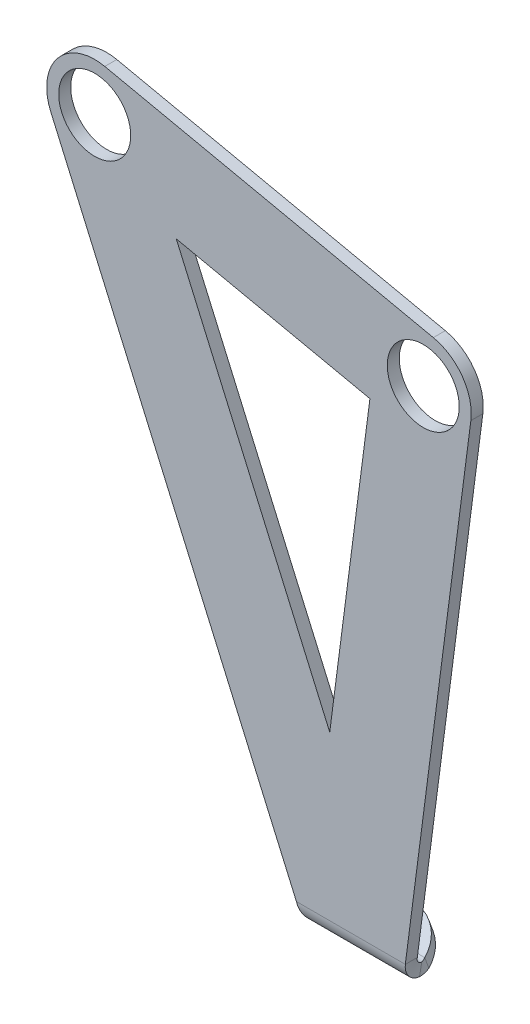
ISO-10303-21;
HEADER;
FILE_DESCRIPTION(('STEP AP214'),'2;1');
FILE_NAME('part.step','',(''),(''),'','','');
FILE_SCHEMA(('AUTOMOTIVE_DESIGN { 1 0 10303 214 1 1 1 1 }'));
ENDSEC;
DATA;
#1=APPLICATION_CONTEXT('core data for automotive mechanical design processes');
#2=APPLICATION_PROTOCOL_DEFINITION('international standard','automotive_design',2000,#1);
#3=PRODUCT_CONTEXT('',#1,'mechanical');
#4=PRODUCT('Part','Part','',(#3));
#5=PRODUCT_RELATED_PRODUCT_CATEGORY('part','',(#4));
#6=PRODUCT_DEFINITION_FORMATION('','',#4);
#7=PRODUCT_DEFINITION_CONTEXT('part definition',#1,'design');
#8=PRODUCT_DEFINITION('design','',#6,#7);
#9=PRODUCT_DEFINITION_SHAPE('','',#8);
#10=(LENGTH_UNIT() NAMED_UNIT(*) SI_UNIT(.MILLI.,.METRE.));
#11=(NAMED_UNIT(*) PLANE_ANGLE_UNIT() SI_UNIT($,.RADIAN.));
#12=(NAMED_UNIT(*) SI_UNIT($,.STERADIAN.) SOLID_ANGLE_UNIT());
#13=UNCERTAINTY_MEASURE_WITH_UNIT(LENGTH_MEASURE(1.E-05),#10,'distance_accuracy_value','');
#14=(GEOMETRIC_REPRESENTATION_CONTEXT(3) GLOBAL_UNCERTAINTY_ASSIGNED_CONTEXT((#13)) GLOBAL_UNIT_ASSIGNED_CONTEXT((#10,
#11,#12)) REPRESENTATION_CONTEXT('',''));
#15=CARTESIAN_POINT('',(0.,0.,0.));
#16=DIRECTION('',(0.,0.,1.));
#17=DIRECTION('',(1.,0.,0.));
#18=AXIS2_PLACEMENT_3D('',#15,#16,#17);
#19=CARTESIAN_POINT('',(-43.1578263867237,-76.3175069818538,1.));
#20=DIRECTION('',(-0.991640383095141,0.12903236266504,0.));
#21=DIRECTION('',(-0.12903236266504,-0.991640383095141,0.));
#22=AXIS2_PLACEMENT_3D('',#19,#20,#21);
#23=PLANE('',#22);
#24=DIRECTION('',(0.12903236266504,0.991640383095141,0.));
#25=VECTOR('',#24,1.);
#26=CARTESIAN_POINT('',(-43.1578263867237,-76.3175069818538,1.));
#27=LINE('',#26,#25);
#28=CARTESIAN_POINT('',(-42.936208375306,-74.6143267470348,1.));
#29=VERTEX_POINT('',#28);
#30=CARTESIAN_POINT('',(-37.475147726472,-32.644946646838,1.));
#31=VERTEX_POINT('',#30);
#32=EDGE_CURVE('E358',#29,#31,#27,.T.);
#33=ORIENTED_EDGE('',*,*,#32,.F.);
#34=CARTESIAN_POINT('',(-42.936208375306,-74.6143267470348,0.));
#35=CARTESIAN_POINT('',(-42.936208375306,-74.6143267470348,1.));
#36=B_SPLINE_CURVE_WITH_KNOTS('',1,(#34,#35),.UNSPECIFIED.,.F.,.F.,(2,2),(0.,1.),.UNSPECIFIED.);
#37=CARTESIAN_POINT('',(-42.936208375306,-74.6143267470348,0.));
#38=VERTEX_POINT('',#37);
#39=EDGE_CURVE('E12',#29,#38,#36,.F.);
#40=ORIENTED_EDGE('',*,*,#39,.T.);
#41=DIRECTION('',(0.12903236266504,0.991640383095141,0.));
#42=VECTOR('',#41,1.);
#43=CARTESIAN_POINT('',(-43.1578263867237,-76.3175069818538,0.));
#44=LINE('',#43,#42);
#45=CARTESIAN_POINT('',(-37.475147726472,-32.644946646838,0.));
#46=VERTEX_POINT('',#45);
#47=EDGE_CURVE('E366',#38,#46,#44,.T.);
#48=ORIENTED_EDGE('',*,*,#47,.T.);
#49=DIRECTION('',(0.,0.,-1.));
#50=VECTOR('',#49,1.);
#51=CARTESIAN_POINT('',(-37.475147726472,-32.644946646838,1.));
#52=LINE('',#51,#50);
#53=EDGE_CURVE('E373',#31,#46,#52,.T.);
#54=ORIENTED_EDGE('',*,*,#53,.F.);
#55=EDGE_LOOP('',(#33,#40,#48,#54));
#56=FACE_BOUND('',#55,.T.);
#57=ADVANCED_FACE('F63',(#56),#23,.F.);
#58=CARTESIAN_POINT('',(-72.4815716564714,-27.852768294985,1.));
#59=DIRECTION('',(0.916064952298627,0.401029928022978,0.));
#60=DIRECTION('',(-0.401029928022978,0.916064952298627,0.));
#61=AXIS2_PLACEMENT_3D('',#58,#59,#60);
#62=PLANE('',#61);
#63=DIRECTION('',(0.401029928022978,-0.916064952298627,0.));
#64=VECTOR('',#63,1.);
#65=CARTESIAN_POINT('',(-72.4815716564714,-27.852768294985,0.));
#66=LINE('',#65,#64);
#67=CARTESIAN_POINT('',(-72.4815716564714,-27.852768294985,0.));
#68=VERTEX_POINT('',#67);
#69=CARTESIAN_POINT('',(-52.0105511538175,-74.6143267470348,0.));
#70=VERTEX_POINT('',#69);
#71=EDGE_CURVE('E363',#68,#70,#66,.T.);
#72=ORIENTED_EDGE('',*,*,#71,.T.);
#73=CARTESIAN_POINT('',(-52.0105511538175,-74.6143267470348,1.));
#74=CARTESIAN_POINT('',(-52.0105511538175,-74.6143267470348,0.));
#75=B_SPLINE_CURVE_WITH_KNOTS('',1,(#73,#74),.UNSPECIFIED.,.F.,.F.,(2,2),(0.,1.),.UNSPECIFIED.);
#76=CARTESIAN_POINT('',(-52.0105511538175,-74.6143267470348,1.));
#77=VERTEX_POINT('',#76);
#78=EDGE_CURVE('E305',#70,#77,#75,.F.);
#79=ORIENTED_EDGE('',*,*,#78,.T.);
#80=DIRECTION('',(0.401029928022978,-0.916064952298627,0.));
#81=VECTOR('',#80,1.);
#82=CARTESIAN_POINT('',(-72.4815716564714,-27.852768294985,1.));
#83=LINE('',#82,#81);
#84=CARTESIAN_POINT('',(-72.4815716564714,-27.852768294985,1.));
#85=VERTEX_POINT('',#84);
#86=EDGE_CURVE('E353',#85,#77,#83,.T.);
#87=ORIENTED_EDGE('',*,*,#86,.F.);
#88=DIRECTION('',(0.,0.,-1.));
#89=VECTOR('',#88,1.);
#90=CARTESIAN_POINT('',(-72.4815716564714,-27.852768294985,1.));
#91=LINE('',#90,#89);
#92=EDGE_CURVE('E376',#85,#68,#91,.T.);
#93=ORIENTED_EDGE('',*,*,#92,.T.);
#94=EDGE_LOOP('',(#72,#79,#87,#93));
#95=FACE_BOUND('',#94,.T.);
#96=ADVANCED_FACE('F404',(#95),#62,.F.);
#97=CARTESIAN_POINT('',(-68.8173118472769,-26.2486485828931,0.));
#98=DIRECTION('',(0.,0.,1.));
#99=DIRECTION('',(1.,0.,0.));
#100=AXIS2_PLACEMENT_3D('',#97,#98,#99);
#101=PLANE('',#100);
#102=CARTESIAN_POINT('',(-41.4417092588526,-32.1288171961778,0.));
#103=DIRECTION('',(0.,0.,1.));
#104=DIRECTION('',(1.,0.,0.));
#105=AXIS2_PLACEMENT_3D('',#102,#103,#104);
#106=CIRCLE('',#105,3.);
#107=CARTESIAN_POINT('',(-38.4417092588526,-32.1288171961778,0.));
#108=VERTEX_POINT('',#107);
#109=EDGE_CURVE('E337',#108,#108,#106,.T.);
#110=ORIENTED_EDGE('',*,*,#109,.T.);
#111=EDGE_LOOP('',(#110));
#112=FACE_BOUND('',#111,.T.);
#113=CARTESIAN_POINT('',(-68.8173118472769,-26.2486485828931,0.));
#114=DIRECTION('',(0.,0.,1.));
#115=DIRECTION('',(1.,0.,0.));
#116=AXIS2_PLACEMENT_3D('',#113,#114,#115);
#117=CIRCLE('',#116,3.00000000000001);
#118=CARTESIAN_POINT('',(-65.8173118472769,-26.2486485828931,0.));
#119=VERTEX_POINT('',#118);
#120=EDGE_CURVE('E341',#119,#119,#117,.T.);
#121=ORIENTED_EDGE('',*,*,#120,.T.);
#122=EDGE_LOOP('',(#121));
#123=FACE_BOUND('',#122,.T.);
#124=DIRECTION('',(0.12903236266504,0.991640383095141,0.));
#125=VECTOR('',#124,1.);
#126=CARTESIAN_POINT('',(-49.2333887004641,-61.0095096787918,0.));
#127=LINE('',#126,#125);
#128=CARTESIAN_POINT('',(-49.2333887004641,-61.0095096787918,0.));
#129=VERTEX_POINT('',#128);
#130=CARTESIAN_POINT('',(-45.8836329374578,-35.2659441151218,0.));
#131=VERTEX_POINT('',#130);
#132=EDGE_CURVE('E323',#129,#131,#127,.T.);
#133=ORIENTED_EDGE('',*,*,#132,.T.);
#134=DIRECTION('',(-0.977700092443724,0.210006021903026,0.));
#135=VECTOR('',#134,1.);
#136=CARTESIAN_POINT('',(-62.0206676034795,-31.7997743952724,0.));
#137=LINE('',#136,#135);
#138=CARTESIAN_POINT('',(-62.0206676034795,-31.7997743952724,0.));
#139=VERTEX_POINT('',#138);
#140=EDGE_CURVE('E326',#131,#139,#137,.T.);
#141=ORIENTED_EDGE('',*,*,#140,.T.);
#142=DIRECTION('',(0.401029928022978,-0.916064952298626,0.));
#143=VECTOR('',#142,1.);
#144=CARTESIAN_POINT('',(-62.0206676034795,-31.7997743952724,0.));
#145=LINE('',#144,#143);
#146=EDGE_CURVE('E318',#139,#129,#145,.T.);
#147=ORIENTED_EDGE('',*,*,#146,.T.);
#148=EDGE_LOOP('',(#133,#141,#147));
#149=FACE_BOUND('',#148,.T.);
#150=ORIENTED_EDGE('',*,*,#47,.F.);
#151=DIRECTION('',(-1.,0.,0.));
#152=VECTOR('',#151,1.);
#153=CARTESIAN_POINT('',(-68.8173118472769,-74.6143267470348,0.));
#154=LINE('',#153,#152);
#155=EDGE_CURVE('E74',#38,#70,#154,.T.);
#156=ORIENTED_EDGE('',*,*,#155,.T.);
#157=ORIENTED_EDGE('',*,*,#71,.F.);
#158=CARTESIAN_POINT('',(-68.8173118472769,-26.2486485828931,0.));
#159=DIRECTION('',(0.,0.,1.));
#160=DIRECTION('',(1.,0.,0.));
#161=AXIS2_PLACEMENT_3D('',#158,#159,#160);
#162=CIRCLE('',#161,4.);
#163=CARTESIAN_POINT('',(-67.9772877596647,-22.3378482131182,0.));
#164=VERTEX_POINT('',#163);
#165=EDGE_CURVE('E347',#164,#68,#162,.T.);
#166=ORIENTED_EDGE('',*,*,#165,.F.);
#167=DIRECTION('',(-0.977700092443724,0.210006021903025,0.));
#168=VECTOR('',#167,1.);
#169=CARTESIAN_POINT('',(-67.9772877596647,-22.3378482131182,0.));
#170=LINE('',#169,#168);
#171=CARTESIAN_POINT('',(-40.6016851712405,-28.2180168264029,0.));
#172=VERTEX_POINT('',#171);
#173=EDGE_CURVE('E354',#172,#164,#170,.T.);
#174=ORIENTED_EDGE('',*,*,#173,.F.);
#175=CARTESIAN_POINT('',(-41.4417092588526,-32.1288171961778,0.));
#176=DIRECTION('',(0.,0.,1.));
#177=DIRECTION('',(1.,0.,0.));
#178=AXIS2_PLACEMENT_3D('',#175,#176,#177);
#179=CIRCLE('',#178,4.);
#180=EDGE_CURVE('E364',#46,#172,#179,.T.);
#181=ORIENTED_EDGE('',*,*,#180,.F.);
#182=EDGE_LOOP('',(#150,#156,#157,#166,#174,#181));
#183=FACE_BOUND('',#182,.T.);
#184=ADVANCED_FACE('F65',(#112,#123,#149,#183),#101,.F.);
#185=CARTESIAN_POINT('',(-68.8173118472769,-26.2486485828931,1.));
#186=DIRECTION('',(0.,0.,1.));
#187=DIRECTION('',(1.,0.,0.));
#188=AXIS2_PLACEMENT_3D('',#185,#186,#187);
#189=PLANE('',#188);
#190=DIRECTION('',(-1.,0.,0.));
#191=VECTOR('',#190,1.);
#192=CARTESIAN_POINT('',(-68.8173118472769,-74.6143267470348,1.));
#193=LINE('',#192,#191);
#194=EDGE_CURVE('E379',#29,#77,#193,.T.);
#195=ORIENTED_EDGE('',*,*,#194,.F.);
#196=ORIENTED_EDGE('',*,*,#32,.T.);
#197=CARTESIAN_POINT('',(-41.4417092588526,-32.1288171961778,1.));
#198=DIRECTION('',(0.,0.,1.));
#199=DIRECTION('',(1.,0.,0.));
#200=AXIS2_PLACEMENT_3D('',#197,#198,#199);
#201=CIRCLE('',#200,4.);
#202=CARTESIAN_POINT('',(-40.6016851712405,-28.2180168264029,1.));
#203=VERTEX_POINT('',#202);
#204=EDGE_CURVE('E355',#31,#203,#201,.T.);
#205=ORIENTED_EDGE('',*,*,#204,.T.);
#206=DIRECTION('',(-0.977700092443724,0.210006021903025,0.));
#207=VECTOR('',#206,1.);
#208=CARTESIAN_POINT('',(-67.9772877596647,-22.3378482131182,1.));
#209=LINE('',#208,#207);
#210=CARTESIAN_POINT('',(-67.9772877596647,-22.3378482131182,1.));
#211=VERTEX_POINT('',#210);
#212=EDGE_CURVE('E357',#203,#211,#209,.T.);
#213=ORIENTED_EDGE('',*,*,#212,.T.);
#214=CARTESIAN_POINT('',(-68.8173118472769,-26.2486485828931,1.));
#215=DIRECTION('',(0.,0.,1.));
#216=DIRECTION('',(1.,0.,0.));
#217=AXIS2_PLACEMENT_3D('',#214,#215,#216);
#218=CIRCLE('',#217,4.);
#219=EDGE_CURVE('E350',#211,#85,#218,.T.);
#220=ORIENTED_EDGE('',*,*,#219,.T.);
#221=ORIENTED_EDGE('',*,*,#86,.T.);
#222=EDGE_LOOP('',(#195,#196,#205,#213,#220,#221));
#223=FACE_BOUND('',#222,.T.);
#224=CARTESIAN_POINT('',(-68.8173118472769,-26.2486485828931,1.));
#225=DIRECTION('',(0.,0.,1.));
#226=DIRECTION('',(1.,0.,0.));
#227=AXIS2_PLACEMENT_3D('',#224,#225,#226);
#228=CIRCLE('',#227,3.00000000000001);
#229=CARTESIAN_POINT('',(-65.8173118472769,-26.2486485828931,1.));
#230=VERTEX_POINT('',#229);
#231=EDGE_CURVE('E344',#230,#230,#228,.T.);
#232=ORIENTED_EDGE('',*,*,#231,.F.);
#233=EDGE_LOOP('',(#232));
#234=FACE_BOUND('',#233,.T.);
#235=CARTESIAN_POINT('',(-41.4417092588526,-32.1288171961778,1.));
#236=DIRECTION('',(0.,0.,1.));
#237=DIRECTION('',(1.,0.,0.));
#238=AXIS2_PLACEMENT_3D('',#235,#236,#237);
#239=CIRCLE('',#238,3.);
#240=CARTESIAN_POINT('',(-38.4417092588526,-32.1288171961778,1.));
#241=VERTEX_POINT('',#240);
#242=EDGE_CURVE('E338',#241,#241,#239,.T.);
#243=ORIENTED_EDGE('',*,*,#242,.F.);
#244=EDGE_LOOP('',(#243));
#245=FACE_BOUND('',#244,.T.);
#246=DIRECTION('',(-0.977700092443724,0.210006021903026,0.));
#247=VECTOR('',#246,1.);
#248=CARTESIAN_POINT('',(-62.0206676034795,-31.7997743952724,1.));
#249=LINE('',#248,#247);
#250=CARTESIAN_POINT('',(-45.8836329374578,-35.2659441151218,1.));
#251=VERTEX_POINT('',#250);
#252=CARTESIAN_POINT('',(-62.0206676034795,-31.7997743952724,1.));
#253=VERTEX_POINT('',#252);
#254=EDGE_CURVE('E317',#251,#253,#249,.T.);
#255=ORIENTED_EDGE('',*,*,#254,.F.);
#256=DIRECTION('',(0.12903236266504,0.991640383095141,0.));
#257=VECTOR('',#256,1.);
#258=CARTESIAN_POINT('',(-49.2333887004641,-61.0095096787918,1.));
#259=LINE('',#258,#257);
#260=CARTESIAN_POINT('',(-49.2333887004641,-61.0095096787918,1.));
#261=VERTEX_POINT('',#260);
#262=EDGE_CURVE('E310',#261,#251,#259,.T.);
#263=ORIENTED_EDGE('',*,*,#262,.F.);
#264=DIRECTION('',(0.401029928022978,-0.916064952298626,0.));
#265=VECTOR('',#264,1.);
#266=CARTESIAN_POINT('',(-62.0206676034795,-31.7997743952724,1.));
#267=LINE('',#266,#265);
#268=EDGE_CURVE('E320',#253,#261,#267,.T.);
#269=ORIENTED_EDGE('',*,*,#268,.F.);
#270=EDGE_LOOP('',(#255,#263,#269));
#271=FACE_BOUND('',#270,.T.);
#272=ADVANCED_FACE('F407',(#223,#234,#245,#271),#189,.T.);
#273=CARTESIAN_POINT('',(-68.8173118472769,-26.2486485828931,1.));
#274=DIRECTION('',(0.,0.,-1.));
#275=DIRECTION('',(-1.,0.,0.));
#276=AXIS2_PLACEMENT_3D('',#273,#274,#275);
#277=CYLINDRICAL_SURFACE('',#276,4.);
#278=ORIENTED_EDGE('',*,*,#165,.T.);
#279=ORIENTED_EDGE('',*,*,#92,.F.);
#280=ORIENTED_EDGE('',*,*,#219,.F.);
#281=DIRECTION('',(0.,0.,-1.));
#282=VECTOR('',#281,1.);
#283=CARTESIAN_POINT('',(-67.9772877596647,-22.3378482131182,1.));
#284=LINE('',#283,#282);
#285=EDGE_CURVE('E360',#211,#164,#284,.T.);
#286=ORIENTED_EDGE('',*,*,#285,.T.);
#287=EDGE_LOOP('',(#278,#279,#280,#286));
#288=FACE_BOUND('',#287,.T.);
#289=ADVANCED_FACE('F405',(#288),#277,.T.);
#290=CARTESIAN_POINT('',(-41.4417092588526,-32.1288171961778,1.));
#291=DIRECTION('',(0.,0.,-1.));
#292=DIRECTION('',(-1.,0.,0.));
#293=AXIS2_PLACEMENT_3D('',#290,#291,#292);
#294=CYLINDRICAL_SURFACE('',#293,4.);
#295=ORIENTED_EDGE('',*,*,#180,.T.);
#296=DIRECTION('',(0.,0.,-1.));
#297=VECTOR('',#296,1.);
#298=CARTESIAN_POINT('',(-40.6016851712405,-28.2180168264029,1.));
#299=LINE('',#298,#297);
#300=EDGE_CURVE('E370',#203,#172,#299,.T.);
#301=ORIENTED_EDGE('',*,*,#300,.F.);
#302=ORIENTED_EDGE('',*,*,#204,.F.);
#303=ORIENTED_EDGE('',*,*,#53,.T.);
#304=EDGE_LOOP('',(#295,#301,#302,#303));
#305=FACE_BOUND('',#304,.T.);
#306=ADVANCED_FACE('F489',(#305),#294,.T.);
#307=CARTESIAN_POINT('',(-67.9772877596647,-22.3378482131182,1.));
#308=DIRECTION('',(-0.210006021903025,-0.977700092443724,0.));
#309=DIRECTION('',(0.977700092443724,-0.210006021903025,0.));
#310=AXIS2_PLACEMENT_3D('',#307,#308,#309);
#311=PLANE('',#310);
#312=ORIENTED_EDGE('',*,*,#173,.T.);
#313=ORIENTED_EDGE('',*,*,#285,.F.);
#314=ORIENTED_EDGE('',*,*,#212,.F.);
#315=ORIENTED_EDGE('',*,*,#300,.T.);
#316=EDGE_LOOP('',(#312,#313,#314,#315));
#317=FACE_BOUND('',#316,.T.);
#318=ADVANCED_FACE('F495',(#317),#311,.F.);
#319=CARTESIAN_POINT('',(-68.8173118472769,-26.2486485828931,1.));
#320=DIRECTION('',(0.,0.,-1.));
#321=DIRECTION('',(-1.,0.,0.));
#322=AXIS2_PLACEMENT_3D('',#319,#320,#321);
#323=CYLINDRICAL_SURFACE('',#322,3.00000000000001);
#324=ORIENTED_EDGE('',*,*,#231,.T.);
#325=EDGE_LOOP('',(#324));
#326=FACE_BOUND('',#325,.T.);
#327=ORIENTED_EDGE('',*,*,#120,.F.);
#328=EDGE_LOOP('',(#327));
#329=FACE_BOUND('',#328,.T.);
#330=ADVANCED_FACE('F689',(#326,#329),#323,.F.);
#331=CARTESIAN_POINT('',(-41.4417092588526,-32.1288171961778,1.));
#332=DIRECTION('',(0.,0.,-1.));
#333=DIRECTION('',(-1.,0.,0.));
#334=AXIS2_PLACEMENT_3D('',#331,#332,#333);
#335=CYLINDRICAL_SURFACE('',#334,3.);
#336=ORIENTED_EDGE('',*,*,#242,.T.);
#337=EDGE_LOOP('',(#336));
#338=FACE_BOUND('',#337,.T.);
#339=ORIENTED_EDGE('',*,*,#109,.F.);
#340=EDGE_LOOP('',(#339));
#341=FACE_BOUND('',#340,.T.);
#342=ADVANCED_FACE('F677',(#338,#341),#335,.F.);
#343=CARTESIAN_POINT('',(-49.2333887004641,-61.0095096787918,1.));
#344=DIRECTION('',(-0.991640383095141,0.12903236266504,0.));
#345=DIRECTION('',(-0.12903236266504,-0.991640383095141,0.));
#346=AXIS2_PLACEMENT_3D('',#343,#344,#345);
#347=PLANE('',#346);
#348=ORIENTED_EDGE('',*,*,#132,.F.);
#349=DIRECTION('',(0.,0.,-1.));
#350=VECTOR('',#349,1.);
#351=CARTESIAN_POINT('',(-49.2333887004641,-61.0095096787918,1.));
#352=LINE('',#351,#350);
#353=EDGE_CURVE('E322',#261,#129,#352,.T.);
#354=ORIENTED_EDGE('',*,*,#353,.F.);
#355=ORIENTED_EDGE('',*,*,#262,.T.);
#356=DIRECTION('',(0.,0.,-1.));
#357=VECTOR('',#356,1.);
#358=CARTESIAN_POINT('',(-45.8836329374578,-35.2659441151218,1.));
#359=LINE('',#358,#357);
#360=EDGE_CURVE('E334',#251,#131,#359,.T.);
#361=ORIENTED_EDGE('',*,*,#360,.T.);
#362=EDGE_LOOP('',(#348,#354,#355,#361));
#363=FACE_BOUND('',#362,.T.);
#364=ADVANCED_FACE('F665',(#363),#347,.T.);
#365=CARTESIAN_POINT('',(-62.0206676034795,-31.7997743952724,1.));
#366=DIRECTION('',(-0.210006021903026,-0.977700092443724,0.));
#367=DIRECTION('',(0.977700092443724,-0.210006021903026,0.));
#368=AXIS2_PLACEMENT_3D('',#365,#366,#367);
#369=PLANE('',#368);
#370=ORIENTED_EDGE('',*,*,#140,.F.);
#371=ORIENTED_EDGE('',*,*,#360,.F.);
#372=ORIENTED_EDGE('',*,*,#254,.T.);
#373=DIRECTION('',(0.,0.,-1.));
#374=VECTOR('',#373,1.);
#375=CARTESIAN_POINT('',(-62.0206676034795,-31.7997743952724,1.));
#376=LINE('',#375,#374);
#377=EDGE_CURVE('E90',#253,#139,#376,.T.);
#378=ORIENTED_EDGE('',*,*,#377,.T.);
#379=EDGE_LOOP('',(#370,#371,#372,#378));
#380=FACE_BOUND('',#379,.T.);
#381=ADVANCED_FACE('F654',(#380),#369,.T.);
#382=CARTESIAN_POINT('',(-62.0206676034795,-31.7997743952724,1.));
#383=DIRECTION('',(0.916064952298626,0.401029928022979,0.));
#384=DIRECTION('',(-0.401029928022979,0.916064952298626,0.));
#385=AXIS2_PLACEMENT_3D('',#382,#383,#384);
#386=PLANE('',#385);
#387=ORIENTED_EDGE('',*,*,#146,.F.);
#388=ORIENTED_EDGE('',*,*,#377,.F.);
#389=ORIENTED_EDGE('',*,*,#268,.T.);
#390=ORIENTED_EDGE('',*,*,#353,.T.);
#391=EDGE_LOOP('',(#387,#388,#389,#390));
#392=FACE_BOUND('',#391,.T.);
#393=ADVANCED_FACE('F245',(#392),#386,.T.);
#394=CARTESIAN_POINT('',(-43.3045828932126,-76.2461969522916,-1.33055218089934));
#395=CARTESIAN_POINT('',(-43.2555762021783,-76.3538067600133,-1.03489666407201));
#396=CARTESIAN_POINT('',(-43.206833077758,-76.3790189746266,-0.711441358834265));
#397=CARTESIAN_POINT('',(-43.1578263867237,-76.3185211673866,-0.402682438853814));
#398=CARTESIAN_POINT('',(-43.3045828932126,-75.3065043315057,-0.988532037573682));
#399=CARTESIAN_POINT('',(-43.2555823980494,-75.3521425688187,-0.863142011092432));
#400=CARTESIAN_POINT('',(-43.2068268818869,-75.3628391625736,-0.725912098883053));
#401=CARTESIAN_POINT('',(-43.1578263867237,-75.3371815265068,-0.594964807359047));
#402=B_SPLINE_SURFACE_WITH_KNOTS('',1,3,((#394,#395,#396,#397),(#398,#399,#400,#401)),
.UNSPECIFIED.,.F.,.F.,.F.,(2,2),(4,4),(0.,1.),(0.,1.),.UNSPECIFIED.);
#403=CARTESIAN_POINT('',(-43.3045828932126,-76.2461969522916,-1.33055218089934));
#404=CARTESIAN_POINT('',(-43.3045828932126,-75.3065043315057,-0.988532037573682));
#405=B_SPLINE_CURVE_WITH_KNOTS('',1,(#403,#404),.UNSPECIFIED.,.F.,.F.,(2,2),(0.,1.),.UNSPECIFIED.);
#406=CARTESIAN_POINT('',(-43.3045828932126,-76.2461969522916,-1.33055218089934));
#407=VERTEX_POINT('',#406);
#408=CARTESIAN_POINT('',(-43.3045828932126,-75.3065043315056,-0.988532037573694));
#409=VERTEX_POINT('',#408);
#410=EDGE_CURVE('E193',#407,#409,#405,.T.);
#411=CARTESIAN_POINT('',(-43.3045828932126,-75.3065043315057,-0.988532037573682));
#412=CARTESIAN_POINT('',(-43.2555823980494,-75.3521425688187,-0.863142011092432));
#413=CARTESIAN_POINT('',(-43.2068268818869,-75.3628391625736,-0.725912098883053));
#414=CARTESIAN_POINT('',(-43.1578263867237,-75.3371815265068,-0.594964807359047));
#415=B_SPLINE_CURVE_WITH_KNOTS('',3,(#411,#412,#413,#414),.UNSPECIFIED.,.F.,.F.,(4,4),(0.,1.),.UNSPECIFIED.);
#416=CARTESIAN_POINT('',(-43.1578263867237,-75.3371815265068,-0.594964807359045));
#417=VERTEX_POINT('',#416);
#418=EDGE_CURVE('E186',#409,#417,#415,.T.);
#419=CARTESIAN_POINT('',(-43.1578263867237,-75.3371815265068,-0.594964807359047));
#420=CARTESIAN_POINT('',(-43.1578263867237,-76.3185211673866,-0.402682438853814));
#421=B_SPLINE_CURVE_WITH_KNOTS('',1,(#419,#420),.UNSPECIFIED.,.F.,.F.,(2,2),(0.,1.),.UNSPECIFIED.);
#422=CARTESIAN_POINT('',(-43.1578263867237,-76.3185211673866,-0.402682438853814));
#423=VERTEX_POINT('',#422);
#424=EDGE_CURVE('E217',#417,#423,#421,.T.);
#425=CARTESIAN_POINT('',(-43.1578263867237,-76.3185211673866,-0.402682438853814));
#426=CARTESIAN_POINT('',(-43.206833077758,-76.3790189746266,-0.711441358834265));
#427=CARTESIAN_POINT('',(-43.2555762021783,-76.3538067600133,-1.03489666407201));
#428=CARTESIAN_POINT('',(-43.3045828932126,-76.2461969522916,-1.33055218089934));
#429=B_SPLINE_CURVE_WITH_KNOTS('',3,(#425,#426,#427,#428),.UNSPECIFIED.,.F.,.F.,(4,4),(0.,1.),.UNSPECIFIED.);
#430=EDGE_CURVE('E208',#407,#423,#429,.F.);
#431=ORIENTED_EDGE('',*,*,#410,.T.);
#432=ORIENTED_EDGE('',*,*,#418,.T.);
#433=ORIENTED_EDGE('',*,*,#424,.T.);
#434=ORIENTED_EDGE('',*,*,#430,.F.);
#435=EDGE_LOOP('',(#431,#432,#433,#434));
#436=FACE_BOUND('',#435,.T.);
#437=ADVANCED_FACE('F216',(#436),#402,.T.);
#438=CARTESIAN_POINT('',(-43.1578263867237,-76.3185211673866,-0.402682438853814));
#439=CARTESIAN_POINT('',(-43.1393562636976,-76.2801914726309,-0.207061544546499));
#440=CARTESIAN_POINT('',(-43.1208900514874,-76.2078748027611,-0.0181903393049971));
#441=CARTESIAN_POINT('',(-43.0839537162511,-76.0036677898277,0.324172979152552));
#442=CARTESIAN_POINT('',(-43.065485548633,-75.8718290767557,0.477564625261117));
#443=CARTESIAN_POINT('',(-43.0285492133967,-75.5640390979978,0.730899334554306));
#444=CARTESIAN_POINT('',(-43.0100810457786,-75.3881595350815,0.830783380871726));
#445=CARTESIAN_POINT('',(-42.9731447105423,-75.0129194309838,0.965349387846605));
#446=CARTESIAN_POINT('',(-42.9546784983321,-74.8136674096946,1.));
#447=CARTESIAN_POINT('',(-42.936208375306,-74.6143267470348,1.));
#448=CARTESIAN_POINT('',(-43.1578263867237,-75.3371815265068,-0.594964807359047));
#449=CARTESIAN_POINT('',(-43.1393563367335,-75.3209235848315,-0.511990155189132));
#450=CARTESIAN_POINT('',(-43.1208900514874,-75.2902495259407,-0.43187780947372));
#451=CARTESIAN_POINT('',(-43.0839537162511,-75.2036326390774,-0.286660246203058));
#452=CARTESIAN_POINT('',(-43.065485548633,-75.1477116463049,-0.221597314886941));
#453=CARTESIAN_POINT('',(-43.0285492133967,-75.0171587853391,-0.114142318419497));
#454=CARTESIAN_POINT('',(-43.0100810457786,-74.9425573307473,-0.0717752859898005));
#455=CARTESIAN_POINT('',(-42.9731447105423,-74.7833946791993,-0.0146974783555172));
#456=CARTESIAN_POINT('',(-42.9546784252962,-74.6988791779297,0.));
#457=CARTESIAN_POINT('',(-42.936208375306,-74.6143267470348,0.));
#458=B_SPLINE_SURFACE_WITH_KNOTS('',1,3,((#438,#439,#440,#441,#442,#443,#444,#445,#446,#447),
(#448,#449,#450,#451,#452,#453,#454,#455,#456,#457)),.UNSPECIFIED.,.F.,.F.,.F.,(2,2),(4,2,2,2,
4),(0.,1.),(0.,0.25,0.5,0.75,1.),.UNSPECIFIED.);
#459=CARTESIAN_POINT('',(-43.1578263867237,-75.3371815265068,-0.594964807359047));
#460=CARTESIAN_POINT('',(-43.1393563367335,-75.3209235848315,-0.511990155189132));
#461=CARTESIAN_POINT('',(-43.1208900514874,-75.2902495259407,-0.43187780947372));
#462=CARTESIAN_POINT('',(-43.0839537162511,-75.2036326390774,-0.286660246203058));
#463=CARTESIAN_POINT('',(-43.065485548633,-75.1477116463049,-0.221597314886941));
#464=CARTESIAN_POINT('',(-43.0285492133967,-75.0171587853391,-0.114142318419497));
#465=CARTESIAN_POINT('',(-43.0100810457786,-74.9425573307473,-0.0717752859898005));
#466=CARTESIAN_POINT('',(-42.9731447105423,-74.7833946791993,-0.0146974783555172));
#467=CARTESIAN_POINT('',(-42.9546784252962,-74.6988791779297,0.));
#468=CARTESIAN_POINT('',(-42.936208375306,-74.6143267470348,0.));
#469=B_SPLINE_CURVE_WITH_KNOTS('',3,(#459,#460,#461,#462,#463,#464,#465,#466,#467,#468),
.UNSPECIFIED.,.F.,.F.,(4,2,2,2,4),(0.,0.25,0.5,0.75,1.),.UNSPECIFIED.);
#470=EDGE_CURVE('E81',#417,#38,#469,.T.);
#471=CARTESIAN_POINT('',(-42.936208375306,-74.6143267470348,1.));
#472=CARTESIAN_POINT('',(-42.9546784983321,-74.8136674096946,1.));
#473=CARTESIAN_POINT('',(-42.9731447105423,-75.0129194309838,0.965349387846605));
#474=CARTESIAN_POINT('',(-43.0100810457786,-75.3881595350815,0.830783380871726));
#475=CARTESIAN_POINT('',(-43.0285492133967,-75.5640390979978,0.730899334554306));
#476=CARTESIAN_POINT('',(-43.065485548633,-75.8718290767557,0.477564625261117));
#477=CARTESIAN_POINT('',(-43.0839537162511,-76.0036677898277,0.324172979152552));
#478=CARTESIAN_POINT('',(-43.1208900514874,-76.2078748027611,-0.0181903393049971));
#479=CARTESIAN_POINT('',(-43.1393562636976,-76.2801914726309,-0.207061544546499));
#480=CARTESIAN_POINT('',(-43.1578263867237,-76.3185211673866,-0.402682438853814));
#481=B_SPLINE_CURVE_WITH_KNOTS('',3,(#471,#472,#473,#474,#475,#476,#477,#478,#479,#480),
.UNSPECIFIED.,.F.,.F.,(4,2,2,2,4),(0.,0.25,0.5,0.75,1.),.UNSPECIFIED.);
#482=EDGE_CURVE('E220',#423,#29,#481,.F.);
#483=ORIENTED_EDGE('',*,*,#424,.F.);
#484=ORIENTED_EDGE('',*,*,#470,.T.);
#485=ORIENTED_EDGE('',*,*,#39,.F.);
#486=ORIENTED_EDGE('',*,*,#482,.F.);
#487=EDGE_LOOP('',(#483,#484,#485,#486));
#488=FACE_BOUND('',#487,.T.);
#489=ADVANCED_FACE('F244',(#488),#458,.T.);
#490=CARTESIAN_POINT('',(-52.0105511538175,-74.6143267470348,1.));
#491=CARTESIAN_POINT('',(-51.9239094276273,-74.8922642390365,1.));
#492=CARTESIAN_POINT('',(-51.8373309437089,-75.1697557983743,0.932073425881524));
#493=CARTESIAN_POINT('',(-51.6641107336003,-75.6626429791832,0.675492599913084));
#494=CARTESIAN_POINT('',(-51.577500628546,-75.8775059729778,0.487062811587064));
#495=CARTESIAN_POINT('',(-51.4042804184374,-76.1962264013163,0.0318828671474179));
#496=CARTESIAN_POINT('',(-51.3176703133831,-76.2998050110095,-0.234469085811424));
#497=CARTESIAN_POINT('',(-51.1444501032745,-76.3723347755836,-0.785387343369841));
#498=CARTESIAN_POINT('',(-51.0578716193562,-76.3412571731416,-1.06937637062548));
#499=CARTESIAN_POINT('',(-50.9712298931659,-76.2461969522916,-1.33055218089932));
#500=CARTESIAN_POINT('',(-52.0105511538175,-74.6143267470348,0.));
#501=CARTESIAN_POINT('',(-51.9239185220805,-74.7322049383326,0.));
#502=CARTESIAN_POINT('',(-51.8373309437089,-74.8499187309209,-0.0288118821234985));
#503=CARTESIAN_POINT('',(-51.6641107336003,-75.0589828201665,-0.137643758438339));
#504=CARTESIAN_POINT('',(-51.577500628546,-75.1501195708454,-0.217568543697437));
#505=CARTESIAN_POINT('',(-51.4042804184374,-75.2853087148706,-0.41063865027019));
#506=CARTESIAN_POINT('',(-51.3176703133831,-75.329242841267,-0.523615068875214));
#507=CARTESIAN_POINT('',(-51.1444501032745,-75.3600072225784,-0.757293744746185));
#508=CARTESIAN_POINT('',(-51.0578625249029,-75.3468210473883,-0.877762771059545));
#509=CARTESIAN_POINT('',(-50.9712298931659,-75.3065043315057,-0.988532037573673));
#510=B_SPLINE_SURFACE_WITH_KNOTS('',1,3,((#490,#491,#492,#493,#494,#495,#496,#497,#498,#499),
(#500,#501,#502,#503,#504,#505,#506,#507,#508,#509)),.UNSPECIFIED.,.F.,.F.,.F.,(2,2),(4,2,2,2,
4),(0.,1.),(0.,0.25,0.5,0.75,1.),.UNSPECIFIED.);
#511=CARTESIAN_POINT('',(-52.0105511538175,-74.6143267470348,0.));
#512=CARTESIAN_POINT('',(-51.9239185220805,-74.7322049383326,0.));
#513=CARTESIAN_POINT('',(-51.8373309437089,-74.8499187309209,-0.0288118821234985));
#514=CARTESIAN_POINT('',(-51.6641107336003,-75.0589828201665,-0.137643758438339));
#515=CARTESIAN_POINT('',(-51.577500628546,-75.1501195708454,-0.217568543697437));
#516=CARTESIAN_POINT('',(-51.4042804184374,-75.2853087148706,-0.41063865027019));
#517=CARTESIAN_POINT('',(-51.3176703133831,-75.329242841267,-0.523615068875214));
#518=CARTESIAN_POINT('',(-51.1444501032745,-75.3600072225784,-0.757293744746185));
#519=CARTESIAN_POINT('',(-51.0578625249029,-75.3468210473883,-0.877762771059545));
#520=CARTESIAN_POINT('',(-50.9712298931659,-75.3065043315057,-0.988532037573673));
#521=B_SPLINE_CURVE_WITH_KNOTS('',3,(#511,#512,#513,#514,#515,#516,#517,#518,#519,#520),
.UNSPECIFIED.,.F.,.F.,(4,2,2,2,4),(0.,0.25,0.5,0.75,1.),.UNSPECIFIED.);
#522=CARTESIAN_POINT('',(-50.9712298931659,-75.3065043315056,-0.988532037573681));
#523=VERTEX_POINT('',#522);
#524=EDGE_CURVE('E221',#70,#523,#521,.T.);
#525=CARTESIAN_POINT('',(-50.9712298931659,-75.3065043315057,-0.988532037573673));
#526=CARTESIAN_POINT('',(-50.9712298931659,-76.2461969522916,-1.33055218089932));
#527=B_SPLINE_CURVE_WITH_KNOTS('',1,(#525,#526),.UNSPECIFIED.,.F.,.F.,(2,2),(0.,1.),.UNSPECIFIED.);
#528=CARTESIAN_POINT('',(-50.9712298931659,-76.2461969522916,-1.33055218089935));
#529=VERTEX_POINT('',#528);
#530=EDGE_CURVE('E169',#523,#529,#527,.T.);
#531=CARTESIAN_POINT('',(-50.9712298931659,-76.2461969522916,-1.33055218089932));
#532=CARTESIAN_POINT('',(-51.0578716193562,-76.3412571731416,-1.06937637062548));
#533=CARTESIAN_POINT('',(-51.1444501032745,-76.3723347755836,-0.785387343369841));
#534=CARTESIAN_POINT('',(-51.3176703133831,-76.2998050110095,-0.234469085811424));
#535=CARTESIAN_POINT('',(-51.4042804184374,-76.1962264013163,0.0318828671474179));
#536=CARTESIAN_POINT('',(-51.577500628546,-75.8775059729778,0.487062811587064));
#537=CARTESIAN_POINT('',(-51.6641107336003,-75.6626429791832,0.675492599913084));
#538=CARTESIAN_POINT('',(-51.8373309437089,-75.1697557983743,0.932073425881524));
#539=CARTESIAN_POINT('',(-51.9239094276273,-74.8922642390365,1.));
#540=CARTESIAN_POINT('',(-52.0105511538175,-74.6143267470348,1.));
#541=B_SPLINE_CURVE_WITH_KNOTS('',3,(#531,#532,#533,#534,#535,#536,#537,#538,#539,#540),
.UNSPECIFIED.,.F.,.F.,(4,2,2,2,4),(0.,0.25,0.5,0.75,1.),.UNSPECIFIED.);
#542=EDGE_CURVE('E212',#77,#529,#541,.F.);
#543=ORIENTED_EDGE('',*,*,#524,.T.);
#544=ORIENTED_EDGE('',*,*,#530,.T.);
#545=ORIENTED_EDGE('',*,*,#542,.F.);
#546=ORIENTED_EDGE('',*,*,#78,.F.);
#547=EDGE_LOOP('',(#543,#544,#545,#546));
#548=FACE_BOUND('',#547,.T.);
#549=ADVANCED_FACE('F249',(#548),#510,.T.);
#550=CARTESIAN_POINT('',(-56.9063037607897,-74.6143267470348,-0.7366));
#551=DIRECTION('',(1.,0.,0.));
#552=DIRECTION('',(0.,0.,-1.));
#553=AXIS2_PLACEMENT_3D('',#550,#551,#552);
#554=CYLINDRICAL_SURFACE('',#553,1.7366);
#555=ORIENTED_EDGE('',*,*,#194,.T.);
#556=ORIENTED_EDGE('',*,*,#542,.T.);
#557=DIRECTION('',(-1.,0.,0.));
#558=VECTOR('',#557,1.);
#559=CARTESIAN_POINT('',(-68.8173118472769,-76.2461969522916,-1.33055218089936));
#560=LINE('',#559,#558);
#561=EDGE_CURVE('E201',#407,#529,#560,.T.);
#562=ORIENTED_EDGE('',*,*,#561,.F.);
#563=ORIENTED_EDGE('',*,*,#430,.T.);
#564=ORIENTED_EDGE('',*,*,#482,.T.);
#565=EDGE_LOOP('',(#555,#556,#562,#563,#564));
#566=FACE_BOUND('',#565,.T.);
#567=ADVANCED_FACE('F206',(#566),#554,.T.);
#568=CARTESIAN_POINT('',(-56.9063037607897,-74.6143267470348,-0.7366));
#569=DIRECTION('',(1.,0.,0.));
#570=DIRECTION('',(0.,0.,-1.));
#571=AXIS2_PLACEMENT_3D('',#568,#569,#570);
#572=CYLINDRICAL_SURFACE('',#571,0.7366);
#573=ORIENTED_EDGE('',*,*,#155,.F.);
#574=ORIENTED_EDGE('',*,*,#470,.F.);
#575=ORIENTED_EDGE('',*,*,#418,.F.);
#576=DIRECTION('',(-1.,0.,0.));
#577=VECTOR('',#576,1.);
#578=CARTESIAN_POINT('',(-68.8173118472769,-75.3065043315056,-0.988532037573681));
#579=LINE('',#578,#577);
#580=EDGE_CURVE('E184',#409,#523,#579,.T.);
#581=ORIENTED_EDGE('',*,*,#580,.T.);
#582=ORIENTED_EDGE('',*,*,#524,.F.);
#583=EDGE_LOOP('',(#573,#574,#575,#581,#582));
#584=FACE_BOUND('',#583,.T.);
#585=ADVANCED_FACE('F455',(#584),#572,.F.);
#586=CARTESIAN_POINT('',(-68.8173118472769,-93.6002236887004,46.3492444139951));
#587=DIRECTION('',(0.,-0.939692620785907,-0.342020143325672));
#588=DIRECTION('',(1.,0.,0.));
#589=AXIS2_PLACEMENT_3D('',#586,#587,#588);
#590=PLANE('',#589);
#591=CARTESIAN_POINT('',(-47.1243879191043,-76.6521922316245,-0.215089318527123));
#592=DIRECTION('',(0.,-0.939692620785907,-0.342020143325672));
#593=DIRECTION('',(1.,0.,0.));
#594=AXIS2_PLACEMENT_3D('',#591,#592,#593);
#595=CIRCLE('',#594,4.);
#596=CARTESIAN_POINT('',(-50.7886477282988,-76.1035509777832,-1.72246877483709));
#597=VERTEX_POINT('',#596);
#598=EDGE_CURVE('E181',#597,#407,#595,.T.);
#599=ORIENTED_EDGE('',*,*,#598,.T.);
#600=ORIENTED_EDGE('',*,*,#561,.T.);
#601=DIRECTION('',(0.401029928022978,0.313312666280802,-0.860819475835613));
#602=VECTOR('',#601,1.);
#603=CARTESIAN_POINT('',(-72.4815716564714,-93.0515824348592,44.8418649576851));
#604=LINE('',#603,#602);
#605=EDGE_CURVE('E175',#529,#597,#604,.T.);
#606=ORIENTED_EDGE('',*,*,#605,.T.);
#607=EDGE_LOOP('',(#599,#600,#606));
#608=FACE_BOUND('',#607,.T.);
#609=ADVANCED_FACE('F200',(#608),#590,.T.);
#610=CARTESIAN_POINT('',(-72.4815716564714,-93.0515824348592,44.8418649576851));
#611=DIRECTION('',(0.916064952298627,-0.137160313460303,0.376844864077496));
#612=DIRECTION('',(-0.401029928022978,-0.313312666280802,0.860819475835613));
#613=AXIS2_PLACEMENT_3D('',#610,#611,#612);
#614=PLANE('',#613);
#615=ORIENTED_EDGE('',*,*,#530,.F.);
#616=DIRECTION('',(0.401029928022978,0.313312666280802,-0.860819475835613));
#617=VECTOR('',#616,1.);
#618=CARTESIAN_POINT('',(-72.4815716564714,-92.1118898140733,45.1838851010108));
#619=LINE('',#618,#617);
#620=CARTESIAN_POINT('',(-50.7886477282988,-75.1638583569973,-1.38044863151142));
#621=VERTEX_POINT('',#620);
#622=EDGE_CURVE('E162',#523,#621,#619,.T.);
#623=ORIENTED_EDGE('',*,*,#622,.T.);
#624=DIRECTION('',(0.,0.939692620785907,0.342020143325672));
#625=VECTOR('',#624,1.);
#626=CARTESIAN_POINT('',(-50.7886477282988,-76.1035509777832,-1.72246877483709));
#627=LINE('',#626,#625);
#628=EDGE_CURVE('E166',#597,#621,#627,.T.);
#629=ORIENTED_EDGE('',*,*,#628,.F.);
#630=ORIENTED_EDGE('',*,*,#605,.F.);
#631=EDGE_LOOP('',(#615,#623,#629,#630));
#632=FACE_BOUND('',#631,.T.);
#633=ADVANCED_FACE('F164',(#632),#614,.F.);
#634=CARTESIAN_POINT('',(-68.8173118472769,-92.6605310679145,46.6912645573208));
#635=DIRECTION('',(0.,-0.939692620785907,-0.342020143325672));
#636=DIRECTION('',(1.,0.,0.));
#637=AXIS2_PLACEMENT_3D('',#634,#635,#636);
#638=PLANE('',#637);
#639=ORIENTED_EDGE('',*,*,#580,.F.);
#640=CARTESIAN_POINT('',(-47.1243879191043,-75.7124996108385,0.126930824798546));
#641=DIRECTION('',(0.,-0.939692620785907,-0.342020143325672));
#642=DIRECTION('',(1.,0.,0.));
#643=AXIS2_PLACEMENT_3D('',#640,#641,#642);
#644=CIRCLE('',#643,4.);
#645=EDGE_CURVE('E179',#621,#409,#644,.T.);
#646=ORIENTED_EDGE('',*,*,#645,.F.);
#647=ORIENTED_EDGE('',*,*,#622,.F.);
#648=EDGE_LOOP('',(#639,#646,#647));
#649=FACE_BOUND('',#648,.T.);
#650=ADVANCED_FACE('F183',(#649),#638,.F.);
#651=CARTESIAN_POINT('',(-47.1243879191043,-76.6521922316245,-0.215089318527123));
#652=DIRECTION('',(0.,0.939692620785907,0.342020143325672));
#653=DIRECTION('',(-1.,0.,0.));
#654=AXIS2_PLACEMENT_3D('',#651,#652,#653);
#655=CYLINDRICAL_SURFACE('',#654,4.);
#656=ORIENTED_EDGE('',*,*,#410,.F.);
#657=ORIENTED_EDGE('',*,*,#598,.F.);
#658=ORIENTED_EDGE('',*,*,#628,.T.);
#659=ORIENTED_EDGE('',*,*,#645,.T.);
#660=EDGE_LOOP('',(#656,#657,#658,#659));
#661=FACE_BOUND('',#660,.T.);
#662=ADVANCED_FACE('F178',(#661),#655,.T.);
#663=CLOSED_SHELL('',(#57,#96,#184,#272,#289,#306,#318,#330,#342,#364,#381,#393,#437,#489,#549,
#567,#585,#609,#633,#650,#662));
#664=MANIFOLD_SOLID_BREP('B2',#663);
#665=ADVANCED_BREP_SHAPE_REPRESENTATION('',(#18,#664),#14);
#666=SHAPE_DEFINITION_REPRESENTATION(#9,#665);
ENDSEC;
END-ISO-10303-21;
